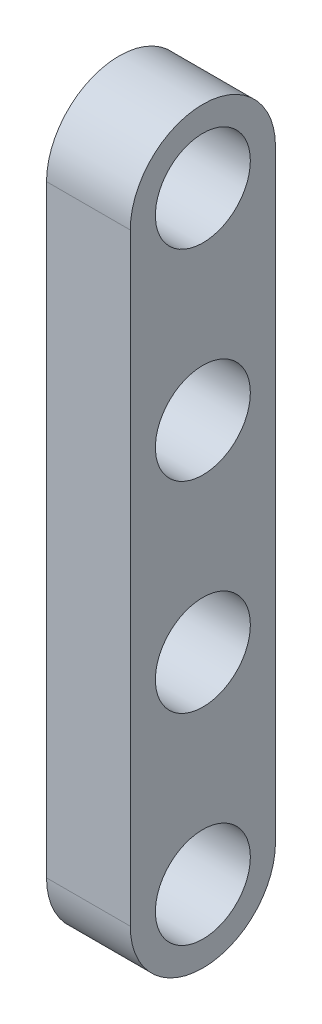
ISO-10303-21;
HEADER;
FILE_DESCRIPTION(('STEP AP214'),'2;1');
FILE_NAME('part.step','',(''),(''),'','','');
FILE_SCHEMA(('AUTOMOTIVE_DESIGN { 1 0 10303 214 1 1 1 1 }'));
ENDSEC;
DATA;
#1=APPLICATION_CONTEXT('core data for automotive mechanical design processes');
#2=APPLICATION_PROTOCOL_DEFINITION('international standard','automotive_design',2000,#1);
#3=PRODUCT_CONTEXT('',#1,'mechanical');
#4=PRODUCT('Part','Part','',(#3));
#5=PRODUCT_RELATED_PRODUCT_CATEGORY('part','',(#4));
#6=PRODUCT_DEFINITION_FORMATION('','',#4);
#7=PRODUCT_DEFINITION_CONTEXT('part definition',#1,'design');
#8=PRODUCT_DEFINITION('design','',#6,#7);
#9=PRODUCT_DEFINITION_SHAPE('','',#8);
#10=(LENGTH_UNIT() NAMED_UNIT(*) SI_UNIT(.MILLI.,.METRE.));
#11=(NAMED_UNIT(*) PLANE_ANGLE_UNIT() SI_UNIT($,.RADIAN.));
#12=(NAMED_UNIT(*) SI_UNIT($,.STERADIAN.) SOLID_ANGLE_UNIT());
#13=UNCERTAINTY_MEASURE_WITH_UNIT(LENGTH_MEASURE(1.E-05),#10,'distance_accuracy_value','');
#14=(GEOMETRIC_REPRESENTATION_CONTEXT(3) GLOBAL_UNCERTAINTY_ASSIGNED_CONTEXT((#13)) GLOBAL_UNIT_ASSIGNED_CONTEXT((#10,
#11,#12)) REPRESENTATION_CONTEXT('',''));
#15=CARTESIAN_POINT('',(0.,0.,0.));
#16=DIRECTION('',(0.,0.,1.));
#17=DIRECTION('',(1.,0.,0.));
#18=AXIS2_PLACEMENT_3D('',#15,#16,#17);
#19=CARTESIAN_POINT('',(5.,17.9999995580371,9.34617512588253E-07));
#20=DIRECTION('',(1.,0.,0.));
#21=DIRECTION('',(0.,0.,-1.));
#22=AXIS2_PLACEMENT_3D('',#19,#20,#21);
#23=PLANE('',#22);
#24=CARTESIAN_POINT('',(5.,-18.0000001508702,4.67308747253981E-07));
#25=DIRECTION('',(1.,0.,0.));
#26=DIRECTION('',(0.,0.,-1.));
#27=AXIS2_PLACEMENT_3D('',#24,#25,#26);
#28=CIRCLE('',#27,2.83499999999999);
#29=CARTESIAN_POINT('',(5.,-18.0000001508702,-2.83499953269124));
#30=VERTEX_POINT('',#29);
#31=EDGE_CURVE('E116',#30,#30,#28,.T.);
#32=ORIENTED_EDGE('',*,*,#31,.F.);
#33=EDGE_LOOP('',(#32));
#34=FACE_BOUND('',#33,.T.);
#35=CARTESIAN_POINT('',(5.,5.99999968356138,3.97364280368961E-07));
#36=DIRECTION('',(1.,0.,0.));
#37=DIRECTION('',(0.,0.,-1.));
#38=AXIS2_PLACEMENT_3D('',#35,#36,#37);
#39=CIRCLE('',#38,2.835);
#40=CARTESIAN_POINT('',(5.,5.99999968356138,-2.83499960263572));
#41=VERTEX_POINT('',#40);
#42=EDGE_CURVE('E128',#41,#41,#39,.T.);
#43=ORIENTED_EDGE('',*,*,#42,.F.);
#44=EDGE_LOOP('',(#43));
#45=FACE_BOUND('',#44,.T.);
#46=CARTESIAN_POINT('',(5.,17.9999996835614,0.));
#47=DIRECTION('',(1.,0.,0.));
#48=DIRECTION('',(0.,0.,-1.));
#49=AXIS2_PLACEMENT_3D('',#46,#47,#48);
#50=CIRCLE('',#49,2.83500046730875);
#51=CARTESIAN_POINT('',(5.,17.9999996835614,-2.83500046730875));
#52=VERTEX_POINT('',#51);
#53=EDGE_CURVE('E11',#52,#52,#50,.T.);
#54=ORIENTED_EDGE('',*,*,#53,.F.);
#55=EDGE_LOOP('',(#54));
#56=FACE_BOUND('',#55,.T.);
#57=CARTESIAN_POINT('',(5.,-6.00000015087016,4.67308775009556E-07));
#58=DIRECTION('',(1.,0.,0.));
#59=DIRECTION('',(0.,0.,-1.));
#60=AXIS2_PLACEMENT_3D('',#57,#58,#59);
#61=CIRCLE('',#60,2.83499999999999);
#62=CARTESIAN_POINT('',(5.,-6.00000015087016,-2.83499953269121));
#63=VERTEX_POINT('',#62);
#64=EDGE_CURVE('E122',#63,#63,#61,.T.);
#65=ORIENTED_EDGE('',*,*,#64,.F.);
#66=EDGE_LOOP('',(#65));
#67=FACE_BOUND('',#66,.T.);
#68=DIRECTION('',(0.,1.,0.));
#69=VECTOR('',#68,1.);
#70=CARTESIAN_POINT('',(5.,-18.0000001508702,-4.33499953269125));
#71=LINE('',#70,#69);
#72=CARTESIAN_POINT('',(5.,-18.0000001508702,-4.33499953269125));
#73=VERTEX_POINT('',#72);
#74=CARTESIAN_POINT('',(5.,17.9999995580371,-4.33499953269124));
#75=VERTEX_POINT('',#74);
#76=EDGE_CURVE('E88',#73,#75,#71,.T.);
#77=ORIENTED_EDGE('',*,*,#76,.T.);
#78=CARTESIAN_POINT('',(5.,17.9999995580371,9.34617512588253E-07));
#79=DIRECTION('',(1.,0.,0.));
#80=DIRECTION('',(0.,0.,-1.));
#81=AXIS2_PLACEMENT_3D('',#78,#79,#80);
#82=CIRCLE('',#81,4.33500046730875);
#83=CARTESIAN_POINT('',(5.,17.9999995580371,4.33500140192627));
#84=VERTEX_POINT('',#83);
#85=EDGE_CURVE('E105',#75,#84,#82,.T.);
#86=ORIENTED_EDGE('',*,*,#85,.T.);
#87=DIRECTION('',(0.,-1.,0.));
#88=VECTOR('',#87,1.);
#89=CARTESIAN_POINT('',(5.,17.9999995580371,4.33500140192627));
#90=LINE('',#89,#88);
#91=CARTESIAN_POINT('',(5.,-18.0000001508702,4.33500140192626));
#92=VERTEX_POINT('',#91);
#93=EDGE_CURVE('E108',#84,#92,#90,.T.);
#94=ORIENTED_EDGE('',*,*,#93,.T.);
#95=CARTESIAN_POINT('',(5.,-18.0000001508702,9.34617507518387E-07));
#96=DIRECTION('',(1.,0.,0.));
#97=DIRECTION('',(0.,0.,-1.));
#98=AXIS2_PLACEMENT_3D('',#95,#96,#97);
#99=CIRCLE('',#98,4.33500046730875);
#100=EDGE_CURVE('E56',#92,#73,#99,.T.);
#101=ORIENTED_EDGE('',*,*,#100,.T.);
#102=EDGE_LOOP('',(#77,#86,#94,#101));
#103=FACE_BOUND('',#102,.T.);
#104=ADVANCED_FACE('F41',(#34,#45,#56,#67,#103),#23,.T.);
#105=CARTESIAN_POINT('',(0.,17.9999995580371,9.34617512588253E-07));
#106=DIRECTION('',(1.,0.,0.));
#107=DIRECTION('',(0.,0.,-1.));
#108=AXIS2_PLACEMENT_3D('',#105,#106,#107);
#109=PLANE('',#108);
#110=CARTESIAN_POINT('',(0.,-18.0000001508702,4.67308747253981E-07));
#111=DIRECTION('',(1.,0.,0.));
#112=DIRECTION('',(0.,0.,-1.));
#113=AXIS2_PLACEMENT_3D('',#110,#111,#112);
#114=CIRCLE('',#113,2.83499999999999);
#115=CARTESIAN_POINT('',(0.,-18.0000001508702,-2.83499953269124));
#116=VERTEX_POINT('',#115);
#117=EDGE_CURVE('E113',#116,#116,#114,.T.);
#118=ORIENTED_EDGE('',*,*,#117,.T.);
#119=EDGE_LOOP('',(#118));
#120=FACE_BOUND('',#119,.T.);
#121=CARTESIAN_POINT('',(0.,-6.00000015087016,4.67308775009556E-07));
#122=DIRECTION('',(1.,0.,0.));
#123=DIRECTION('',(0.,0.,-1.));
#124=AXIS2_PLACEMENT_3D('',#121,#122,#123);
#125=CIRCLE('',#124,2.83499999999999);
#126=CARTESIAN_POINT('',(0.,-6.00000015087016,-2.83499953269121));
#127=VERTEX_POINT('',#126);
#128=EDGE_CURVE('E119',#127,#127,#125,.T.);
#129=ORIENTED_EDGE('',*,*,#128,.T.);
#130=EDGE_LOOP('',(#129));
#131=FACE_BOUND('',#130,.T.);
#132=CARTESIAN_POINT('',(0.,5.99999968356138,3.97364280368961E-07));
#133=DIRECTION('',(1.,0.,0.));
#134=DIRECTION('',(0.,0.,-1.));
#135=AXIS2_PLACEMENT_3D('',#132,#133,#134);
#136=CIRCLE('',#135,2.835);
#137=CARTESIAN_POINT('',(0.,5.99999968356138,-2.83499960263572));
#138=VERTEX_POINT('',#137);
#139=EDGE_CURVE('E125',#138,#138,#136,.T.);
#140=ORIENTED_EDGE('',*,*,#139,.T.);
#141=EDGE_LOOP('',(#140));
#142=FACE_BOUND('',#141,.T.);
#143=CARTESIAN_POINT('',(0.,17.9999996835614,0.));
#144=DIRECTION('',(1.,0.,0.));
#145=DIRECTION('',(0.,0.,-1.));
#146=AXIS2_PLACEMENT_3D('',#143,#144,#145);
#147=CIRCLE('',#146,2.83500046730875);
#148=CARTESIAN_POINT('',(0.,17.9999996835614,-2.83500046730875));
#149=VERTEX_POINT('',#148);
#150=EDGE_CURVE('E45',#149,#149,#147,.T.);
#151=ORIENTED_EDGE('',*,*,#150,.T.);
#152=EDGE_LOOP('',(#151));
#153=FACE_BOUND('',#152,.T.);
#154=CARTESIAN_POINT('',(0.,17.9999995580371,9.34617512588253E-07));
#155=DIRECTION('',(1.,0.,0.));
#156=DIRECTION('',(0.,0.,-1.));
#157=AXIS2_PLACEMENT_3D('',#154,#155,#156);
#158=CIRCLE('',#157,4.33500046730875);
#159=CARTESIAN_POINT('',(0.,17.9999995580371,-4.33499953269124));
#160=VERTEX_POINT('',#159);
#161=CARTESIAN_POINT('',(0.,17.9999995580371,4.33500140192627));
#162=VERTEX_POINT('',#161);
#163=EDGE_CURVE('E64',#160,#162,#158,.T.);
#164=ORIENTED_EDGE('',*,*,#163,.F.);
#165=DIRECTION('',(0.,1.,0.));
#166=VECTOR('',#165,1.);
#167=CARTESIAN_POINT('',(0.,-18.0000001508702,-4.33499953269125));
#168=LINE('',#167,#166);
#169=CARTESIAN_POINT('',(0.,-18.0000001508702,-4.33499953269125));
#170=VERTEX_POINT('',#169);
#171=EDGE_CURVE('E86',#170,#160,#168,.T.);
#172=ORIENTED_EDGE('',*,*,#171,.F.);
#173=CARTESIAN_POINT('',(0.,-18.0000001508702,9.34617507518387E-07));
#174=DIRECTION('',(1.,0.,0.));
#175=DIRECTION('',(0.,0.,-1.));
#176=AXIS2_PLACEMENT_3D('',#173,#174,#175);
#177=CIRCLE('',#176,4.33500046730875);
#178=CARTESIAN_POINT('',(0.,-18.0000001508702,4.33500140192626));
#179=VERTEX_POINT('',#178);
#180=EDGE_CURVE('E93',#179,#170,#177,.T.);
#181=ORIENTED_EDGE('',*,*,#180,.F.);
#182=DIRECTION('',(0.,-1.,0.));
#183=VECTOR('',#182,1.);
#184=CARTESIAN_POINT('',(0.,17.9999995580371,4.33500140192627));
#185=LINE('',#184,#183);
#186=EDGE_CURVE('E98',#162,#179,#185,.T.);
#187=ORIENTED_EDGE('',*,*,#186,.F.);
#188=EDGE_LOOP('',(#164,#172,#181,#187));
#189=FACE_BOUND('',#188,.T.);
#190=ADVANCED_FACE('F43',(#120,#131,#142,#153,#189),#109,.F.);
#191=CARTESIAN_POINT('',(5.,17.9999996835614,0.));
#192=DIRECTION('',(-1.,0.,0.));
#193=DIRECTION('',(0.,0.,1.));
#194=AXIS2_PLACEMENT_3D('',#191,#192,#193);
#195=CYLINDRICAL_SURFACE('',#194,2.83500046730875);
#196=ORIENTED_EDGE('',*,*,#53,.T.);
#197=EDGE_LOOP('',(#196));
#198=FACE_BOUND('',#197,.T.);
#199=ORIENTED_EDGE('',*,*,#150,.F.);
#200=EDGE_LOOP('',(#199));
#201=FACE_BOUND('',#200,.T.);
#202=ADVANCED_FACE('F139',(#198,#201),#195,.F.);
#203=CARTESIAN_POINT('',(5.,5.99999968356138,3.97364280368961E-07));
#204=DIRECTION('',(-1.,0.,0.));
#205=DIRECTION('',(0.,0.,1.));
#206=AXIS2_PLACEMENT_3D('',#203,#204,#205);
#207=CYLINDRICAL_SURFACE('',#206,2.835);
#208=ORIENTED_EDGE('',*,*,#42,.T.);
#209=EDGE_LOOP('',(#208));
#210=FACE_BOUND('',#209,.T.);
#211=ORIENTED_EDGE('',*,*,#139,.F.);
#212=EDGE_LOOP('',(#211));
#213=FACE_BOUND('',#212,.T.);
#214=ADVANCED_FACE('F136',(#210,#213),#207,.F.);
#215=CARTESIAN_POINT('',(5.,-6.00000015087016,4.67308775009556E-07));
#216=DIRECTION('',(-1.,0.,0.));
#217=DIRECTION('',(0.,0.,1.));
#218=AXIS2_PLACEMENT_3D('',#215,#216,#217);
#219=CYLINDRICAL_SURFACE('',#218,2.83499999999999);
#220=ORIENTED_EDGE('',*,*,#64,.T.);
#221=EDGE_LOOP('',(#220));
#222=FACE_BOUND('',#221,.T.);
#223=ORIENTED_EDGE('',*,*,#128,.F.);
#224=EDGE_LOOP('',(#223));
#225=FACE_BOUND('',#224,.T.);
#226=ADVANCED_FACE('F138',(#222,#225),#219,.F.);
#227=CARTESIAN_POINT('',(5.,-18.0000001508702,4.67308747253981E-07));
#228=DIRECTION('',(-1.,0.,0.));
#229=DIRECTION('',(0.,0.,1.));
#230=AXIS2_PLACEMENT_3D('',#227,#228,#229);
#231=CYLINDRICAL_SURFACE('',#230,2.83499999999999);
#232=ORIENTED_EDGE('',*,*,#31,.T.);
#233=EDGE_LOOP('',(#232));
#234=FACE_BOUND('',#233,.T.);
#235=ORIENTED_EDGE('',*,*,#117,.F.);
#236=EDGE_LOOP('',(#235));
#237=FACE_BOUND('',#236,.T.);
#238=ADVANCED_FACE('F146',(#234,#237),#231,.F.);
#239=CARTESIAN_POINT('',(0.,17.9999995580371,9.34617512588253E-07));
#240=DIRECTION('',(1.,0.,0.));
#241=DIRECTION('',(0.,0.,-1.));
#242=AXIS2_PLACEMENT_3D('',#239,#240,#241);
#243=CYLINDRICAL_SURFACE('',#242,4.33500046730875);
#244=ORIENTED_EDGE('',*,*,#85,.F.);
#245=DIRECTION('',(1.,0.,0.));
#246=VECTOR('',#245,1.);
#247=CARTESIAN_POINT('',(0.,17.9999995580371,-4.33499953269124));
#248=LINE('',#247,#246);
#249=EDGE_CURVE('E89',#160,#75,#248,.T.);
#250=ORIENTED_EDGE('',*,*,#249,.F.);
#251=ORIENTED_EDGE('',*,*,#163,.T.);
#252=DIRECTION('',(1.,0.,0.));
#253=VECTOR('',#252,1.);
#254=CARTESIAN_POINT('',(0.,17.9999995580371,4.33500140192627));
#255=LINE('',#254,#253);
#256=EDGE_CURVE('E100',#162,#84,#255,.T.);
#257=ORIENTED_EDGE('',*,*,#256,.T.);
#258=EDGE_LOOP('',(#244,#250,#251,#257));
#259=FACE_BOUND('',#258,.T.);
#260=ADVANCED_FACE('F171',(#259),#243,.T.);
#261=CARTESIAN_POINT('',(0.,-18.0000001508702,-4.33499953269125));
#262=DIRECTION('',(0.,0.,-1.));
#263=DIRECTION('',(0.,1.,0.));
#264=AXIS2_PLACEMENT_3D('',#261,#262,#263);
#265=PLANE('',#264);
#266=ORIENTED_EDGE('',*,*,#76,.F.);
#267=DIRECTION('',(1.,0.,0.));
#268=VECTOR('',#267,1.);
#269=CARTESIAN_POINT('',(0.,-18.0000001508702,-4.33499953269125));
#270=LINE('',#269,#268);
#271=EDGE_CURVE('E82',#170,#73,#270,.T.);
#272=ORIENTED_EDGE('',*,*,#271,.F.);
#273=ORIENTED_EDGE('',*,*,#171,.T.);
#274=ORIENTED_EDGE('',*,*,#249,.T.);
#275=EDGE_LOOP('',(#266,#272,#273,#274));
#276=FACE_BOUND('',#275,.T.);
#277=ADVANCED_FACE('F84',(#276),#265,.T.);
#278=CARTESIAN_POINT('',(0.,-18.0000001508702,9.34617507518387E-07));
#279=DIRECTION('',(1.,0.,0.));
#280=DIRECTION('',(0.,0.,-1.));
#281=AXIS2_PLACEMENT_3D('',#278,#279,#280);
#282=CYLINDRICAL_SURFACE('',#281,4.33500046730875);
#283=ORIENTED_EDGE('',*,*,#100,.F.);
#284=DIRECTION('',(1.,0.,0.));
#285=VECTOR('',#284,1.);
#286=CARTESIAN_POINT('',(0.,-18.0000001508702,4.33500140192626));
#287=LINE('',#286,#285);
#288=EDGE_CURVE('E90',#179,#92,#287,.T.);
#289=ORIENTED_EDGE('',*,*,#288,.F.);
#290=ORIENTED_EDGE('',*,*,#180,.T.);
#291=ORIENTED_EDGE('',*,*,#271,.T.);
#292=EDGE_LOOP('',(#283,#289,#290,#291));
#293=FACE_BOUND('',#292,.T.);
#294=ADVANCED_FACE('F94',(#293),#282,.T.);
#295=CARTESIAN_POINT('',(0.,17.9999995580371,4.33500140192627));
#296=DIRECTION('',(0.,0.,1.));
#297=DIRECTION('',(0.,-1.,0.));
#298=AXIS2_PLACEMENT_3D('',#295,#296,#297);
#299=PLANE('',#298);
#300=ORIENTED_EDGE('',*,*,#93,.F.);
#301=ORIENTED_EDGE('',*,*,#256,.F.);
#302=ORIENTED_EDGE('',*,*,#186,.T.);
#303=ORIENTED_EDGE('',*,*,#288,.T.);
#304=EDGE_LOOP('',(#300,#301,#302,#303));
#305=FACE_BOUND('',#304,.T.);
#306=ADVANCED_FACE('F169',(#305),#299,.T.);
#307=CLOSED_SHELL('',(#104,#190,#202,#214,#226,#238,#260,#277,#294,#306));
#308=MANIFOLD_SOLID_BREP('B2',#307);
#309=ADVANCED_BREP_SHAPE_REPRESENTATION('',(#18,#308),#14);
#310=SHAPE_DEFINITION_REPRESENTATION(#9,#309);
ENDSEC;
END-ISO-10303-21;
